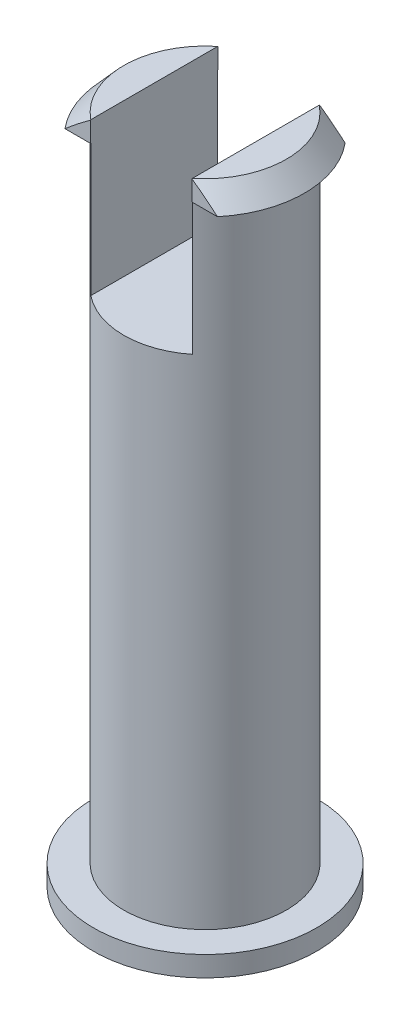
ISO-10303-21;
HEADER;
FILE_DESCRIPTION(('STEP AP214'),'2;1');
FILE_NAME('part.step','',(''),(''),'','','');
FILE_SCHEMA(('AUTOMOTIVE_DESIGN { 1 0 10303 214 1 1 1 1 }'));
ENDSEC;
DATA;
#1=APPLICATION_CONTEXT('core data for automotive mechanical design processes');
#2=APPLICATION_PROTOCOL_DEFINITION('international standard','automotive_design',2000,#1);
#3=PRODUCT_CONTEXT('',#1,'mechanical');
#4=PRODUCT('Part','Part','',(#3));
#5=PRODUCT_RELATED_PRODUCT_CATEGORY('part','',(#4));
#6=PRODUCT_DEFINITION_FORMATION('','',#4);
#7=PRODUCT_DEFINITION_CONTEXT('part definition',#1,'design');
#8=PRODUCT_DEFINITION('design','',#6,#7);
#9=PRODUCT_DEFINITION_SHAPE('','',#8);
#10=(LENGTH_UNIT() NAMED_UNIT(*) SI_UNIT(.MILLI.,.METRE.));
#11=(NAMED_UNIT(*) PLANE_ANGLE_UNIT() SI_UNIT($,.RADIAN.));
#12=(NAMED_UNIT(*) SI_UNIT($,.STERADIAN.) SOLID_ANGLE_UNIT());
#13=UNCERTAINTY_MEASURE_WITH_UNIT(LENGTH_MEASURE(1.E-05),#10,'distance_accuracy_value','');
#14=(GEOMETRIC_REPRESENTATION_CONTEXT(3) GLOBAL_UNCERTAINTY_ASSIGNED_CONTEXT((#13)) GLOBAL_UNIT_ASSIGNED_CONTEXT((#10,
#11,#12)) REPRESENTATION_CONTEXT('',''));
#15=CARTESIAN_POINT('',(0.,0.,0.));
#16=DIRECTION('',(0.,0.,1.));
#17=DIRECTION('',(1.,0.,0.));
#18=AXIS2_PLACEMENT_3D('',#15,#16,#17);
#19=CARTESIAN_POINT('',(0.,32.,0.));
#20=DIRECTION('',(0.,1.,0.));
#21=DIRECTION('',(0.,0.,1.));
#22=AXIS2_PLACEMENT_3D('',#19,#20,#21);
#23=PLANE('',#22);
#24=CARTESIAN_POINT('',(0.,32.,0.));
#25=DIRECTION('',(0.,-1.,0.));
#26=DIRECTION('',(0.,0.,-1.));
#27=AXIS2_PLACEMENT_3D('',#24,#25,#26);
#28=CIRCLE('',#27,3.99999999999999);
#29=CARTESIAN_POINT('',(2.5,32.,-3.12249899919918));
#30=VERTEX_POINT('',#29);
#31=CARTESIAN_POINT('',(2.5,32.,3.12249899919918));
#32=VERTEX_POINT('',#31);
#33=EDGE_CURVE('E141',#30,#32,#28,.T.);
#34=ORIENTED_EDGE('',*,*,#33,.F.);
#35=DIRECTION('',(0.,0.,-1.));
#36=VECTOR('',#35,1.);
#37=CARTESIAN_POINT('',(2.5,32.,4.));
#38=LINE('',#37,#36);
#39=EDGE_CURVE('E181',#32,#30,#38,.T.);
#40=ORIENTED_EDGE('',*,*,#39,.F.);
#41=EDGE_LOOP('',(#34,#40));
#42=FACE_BOUND('',#41,.T.);
#43=ADVANCED_FACE('F32',(#42),#23,.T.);
#44=CARTESIAN_POINT('',(-2.5,32.,3.12249899919919));
#45=VERTEX_POINT('',#44);
#46=CARTESIAN_POINT('',(-2.5,32.,-3.12249899919919));
#47=VERTEX_POINT('',#46);
#48=EDGE_CURVE('E184',#45,#47,#28,.T.);
#49=ORIENTED_EDGE('',*,*,#48,.F.);
#50=DIRECTION('',(0.,0.,1.));
#51=VECTOR('',#50,1.);
#52=CARTESIAN_POINT('',(-2.5,32.,4.));
#53=LINE('',#52,#51);
#54=EDGE_CURVE('E256',#47,#45,#53,.T.);
#55=ORIENTED_EDGE('',*,*,#54,.F.);
#56=EDGE_LOOP('',(#49,#55));
#57=FACE_BOUND('',#56,.T.);
#58=ADVANCED_FACE('F245',(#57),#23,.T.);
#59=CARTESIAN_POINT('',(0.,32.,0.));
#60=DIRECTION('',(0.,-1.,0.));
#61=DIRECTION('',(0.,0.,-1.));
#62=AXIS2_PLACEMENT_3D('',#59,#60,#61);
#63=CYLINDRICAL_SURFACE('',#62,4.);
#64=CARTESIAN_POINT('',(0.,31.,0.));
#65=DIRECTION('',(0.,1.,0.));
#66=DIRECTION('',(0.,0.,1.));
#67=AXIS2_PLACEMENT_3D('',#64,#65,#66);
#68=CIRCLE('',#67,4.);
#69=CARTESIAN_POINT('',(2.5,31.,3.1224989991992));
#70=VERTEX_POINT('',#69);
#71=CARTESIAN_POINT('',(2.5,31.,-3.1224989991992));
#72=VERTEX_POINT('',#71);
#73=EDGE_CURVE('E163',#70,#72,#68,.T.);
#74=ORIENTED_EDGE('',*,*,#73,.F.);
#75=DIRECTION('',(0.,-1.,0.));
#76=VECTOR('',#75,1.);
#77=CARTESIAN_POINT('',(2.5,32.,3.1224989991992));
#78=LINE('',#77,#76);
#79=CARTESIAN_POINT('',(2.5,24.5,3.1224989991992));
#80=VERTEX_POINT('',#79);
#81=EDGE_CURVE('E274',#70,#80,#78,.T.);
#82=ORIENTED_EDGE('',*,*,#81,.T.);
#83=CARTESIAN_POINT('',(0.,24.5,0.));
#84=DIRECTION('',(0.,-1.,0.));
#85=DIRECTION('',(0.,0.,-1.));
#86=AXIS2_PLACEMENT_3D('',#83,#84,#85);
#87=CIRCLE('',#86,4.);
#88=CARTESIAN_POINT('',(-2.5,24.5,3.1224989991992));
#89=VERTEX_POINT('',#88);
#90=EDGE_CURVE('E168',#80,#89,#87,.T.);
#91=ORIENTED_EDGE('',*,*,#90,.T.);
#92=DIRECTION('',(0.,-1.,0.));
#93=VECTOR('',#92,1.);
#94=CARTESIAN_POINT('',(-2.5,32.,3.1224989991992));
#95=LINE('',#94,#93);
#96=CARTESIAN_POINT('',(-2.5,31.,3.1224989991992));
#97=VERTEX_POINT('',#96);
#98=EDGE_CURVE('E279',#89,#97,#95,.F.);
#99=ORIENTED_EDGE('',*,*,#98,.T.);
#100=CARTESIAN_POINT('',(-2.5,31.,-3.1224989991992));
#101=VERTEX_POINT('',#100);
#102=EDGE_CURVE('E160',#101,#97,#68,.T.);
#103=ORIENTED_EDGE('',*,*,#102,.F.);
#104=DIRECTION('',(0.,-1.,0.));
#105=VECTOR('',#104,1.);
#106=CARTESIAN_POINT('',(-2.5,32.,-3.1224989991992));
#107=LINE('',#106,#105);
#108=CARTESIAN_POINT('',(-2.5,24.5,-3.1224989991992));
#109=VERTEX_POINT('',#108);
#110=EDGE_CURVE('E284',#101,#109,#107,.T.);
#111=ORIENTED_EDGE('',*,*,#110,.T.);
#112=CARTESIAN_POINT('',(2.5,24.5,-3.1224989991992));
#113=VERTEX_POINT('',#112);
#114=EDGE_CURVE('E167',#109,#113,#87,.T.);
#115=ORIENTED_EDGE('',*,*,#114,.T.);
#116=DIRECTION('',(0.,-1.,0.));
#117=VECTOR('',#116,1.);
#118=CARTESIAN_POINT('',(2.5,32.,-3.1224989991992));
#119=LINE('',#118,#117);
#120=EDGE_CURVE('E269',#113,#72,#119,.F.);
#121=ORIENTED_EDGE('',*,*,#120,.T.);
#122=EDGE_LOOP('',(#74,#82,#91,#99,#103,#111,#115,#121));
#123=FACE_BOUND('',#122,.T.);
#124=CARTESIAN_POINT('',(0.,0.,0.));
#125=DIRECTION('',(0.,-1.,0.));
#126=DIRECTION('',(0.,0.,-1.));
#127=AXIS2_PLACEMENT_3D('',#124,#125,#126);
#128=CIRCLE('',#127,4.);
#129=CARTESIAN_POINT('',(0.,0.,-4.));
#130=VERTEX_POINT('',#129);
#131=EDGE_CURVE('E156',#130,#130,#128,.T.);
#132=ORIENTED_EDGE('',*,*,#131,.F.);
#133=EDGE_LOOP('',(#132));
#134=FACE_BOUND('',#133,.T.);
#135=ADVANCED_FACE('F34',(#123,#134),#63,.T.);
#136=CARTESIAN_POINT('',(0.,-1.,0.));
#137=DIRECTION('',(0.,1.,0.));
#138=DIRECTION('',(0.,0.,1.));
#139=AXIS2_PLACEMENT_3D('',#136,#137,#138);
#140=CYLINDRICAL_SURFACE('',#139,5.5);
#141=CARTESIAN_POINT('',(0.,-1.,0.));
#142=DIRECTION('',(0.,-1.,0.));
#143=DIRECTION('',(0.,0.,-1.));
#144=AXIS2_PLACEMENT_3D('',#141,#142,#143);
#145=CIRCLE('',#144,5.5);
#146=CARTESIAN_POINT('',(0.,-1.,-5.5));
#147=VERTEX_POINT('',#146);
#148=EDGE_CURVE('E150',#147,#147,#145,.T.);
#149=ORIENTED_EDGE('',*,*,#148,.F.);
#150=EDGE_LOOP('',(#149));
#151=FACE_BOUND('',#150,.T.);
#152=CARTESIAN_POINT('',(0.,0.,0.));
#153=DIRECTION('',(0.,-1.,0.));
#154=DIRECTION('',(0.,0.,-1.));
#155=AXIS2_PLACEMENT_3D('',#152,#153,#154);
#156=CIRCLE('',#155,5.5);
#157=CARTESIAN_POINT('',(0.,0.,-5.5));
#158=VERTEX_POINT('',#157);
#159=EDGE_CURVE('E147',#158,#158,#156,.T.);
#160=ORIENTED_EDGE('',*,*,#159,.T.);
#161=EDGE_LOOP('',(#160));
#162=FACE_BOUND('',#161,.T.);
#163=ADVANCED_FACE('F236',(#151,#162),#140,.T.);
#164=CARTESIAN_POINT('',(0.,-1.,0.));
#165=DIRECTION('',(0.,-1.,0.));
#166=DIRECTION('',(0.,0.,-1.));
#167=AXIS2_PLACEMENT_3D('',#164,#165,#166);
#168=PLANE('',#167);
#169=ORIENTED_EDGE('',*,*,#148,.T.);
#170=EDGE_LOOP('',(#169));
#171=FACE_BOUND('',#170,.T.);
#172=ADVANCED_FACE('F231',(#171),#168,.T.);
#173=CARTESIAN_POINT('',(0.,0.,0.));
#174=DIRECTION('',(0.,-1.,0.));
#175=DIRECTION('',(0.,0.,-1.));
#176=AXIS2_PLACEMENT_3D('',#173,#174,#175);
#177=PLANE('',#176);
#178=ORIENTED_EDGE('',*,*,#131,.T.);
#179=EDGE_LOOP('',(#178));
#180=FACE_BOUND('',#179,.T.);
#181=ORIENTED_EDGE('',*,*,#159,.F.);
#182=EDGE_LOOP('',(#181));
#183=FACE_BOUND('',#182,.T.);
#184=ADVANCED_FACE('F235',(#180,#183),#177,.F.);
#185=CARTESIAN_POINT('',(0.,31.,0.));
#186=DIRECTION('',(0.,1.,0.));
#187=DIRECTION('',(0.,0.,1.));
#188=AXIS2_PLACEMENT_3D('',#185,#186,#187);
#189=PLANE('',#188);
#190=DIRECTION('',(-1.,0.,0.));
#191=VECTOR('',#190,1.);
#192=CARTESIAN_POINT('',(-3.75,31.,-3.142053468673));
#193=LINE('',#192,#191);
#194=CARTESIAN_POINT('',(-2.5,31.,-3.142053468673));
#195=VERTEX_POINT('',#194);
#196=CARTESIAN_POINT('',(-3.75,31.,-3.142053468673));
#197=VERTEX_POINT('',#196);
#198=EDGE_CURVE('E132',#195,#197,#193,.T.);
#199=ORIENTED_EDGE('',*,*,#198,.F.);
#200=DIRECTION('',(0.,0.,1.));
#201=VECTOR('',#200,1.);
#202=CARTESIAN_POINT('',(-2.5,31.,0.));
#203=LINE('',#202,#201);
#204=EDGE_CURVE('E280',#195,#101,#203,.T.);
#205=ORIENTED_EDGE('',*,*,#204,.T.);
#206=ORIENTED_EDGE('',*,*,#102,.T.);
#207=CARTESIAN_POINT('',(-2.5,31.,3.142053468673));
#208=VERTEX_POINT('',#207);
#209=EDGE_CURVE('E276',#97,#208,#203,.T.);
#210=ORIENTED_EDGE('',*,*,#209,.T.);
#211=DIRECTION('',(1.,0.,0.));
#212=VECTOR('',#211,1.);
#213=CARTESIAN_POINT('',(-3.75,31.,3.142053468673));
#214=LINE('',#213,#212);
#215=CARTESIAN_POINT('',(-3.75,31.,3.142053468673));
#216=VERTEX_POINT('',#215);
#217=EDGE_CURVE('E133',#216,#208,#214,.T.);
#218=ORIENTED_EDGE('',*,*,#217,.F.);
#219=CARTESIAN_POINT('',(0.,31.,0.));
#220=DIRECTION('',(0.,1.,0.));
#221=DIRECTION('',(0.,0.,1.));
#222=AXIS2_PLACEMENT_3D('',#219,#220,#221);
#223=CIRCLE('',#222,4.89234095295902);
#224=EDGE_CURVE('E286',#197,#216,#223,.T.);
#225=ORIENTED_EDGE('',*,*,#224,.F.);
#226=EDGE_LOOP('',(#199,#205,#206,#210,#218,#225));
#227=FACE_BOUND('',#226,.T.);
#228=ADVANCED_FACE('F240',(#227),#189,.F.);
#229=CARTESIAN_POINT('',(-3.75,32.,-3.142053468673));
#230=DIRECTION('',(0.,0.,1.));
#231=DIRECTION('',(1.,0.,0.));
#232=AXIS2_PLACEMENT_3D('',#229,#230,#231);
#233=PLANE('',#232);
#234=ORIENTED_EDGE('',*,*,#198,.T.);
#235=CARTESIAN_POINT('',(-5.75140238998282,29.1381890385367,-3.142053468673));
#236=CARTESIAN_POINT('',(-5.66143479160412,29.2266658021532,-3.142053468673));
#237=CARTESIAN_POINT('',(-5.57123159952465,29.3149027677412,-3.142053468673));
#238=CARTESIAN_POINT('',(-5.39028417101633,29.4908232063128,-3.142053468673));
#239=CARTESIAN_POINT('',(-5.29953992516586,29.5785066696028,-3.142053468673));
#240=CARTESIAN_POINT('',(-5.02651423388417,29.8404974377583,-3.142053468673));
#241=CARTESIAN_POINT('',(-4.84332272716632,30.013860658631,-3.142053468673));
#242=CARTESIAN_POINT('',(-4.47537104860759,30.3557161383797,-3.142053468673));
#243=CARTESIAN_POINT('',(-4.29063795138507,30.5242374796827,-3.142053468673));
#244=CARTESIAN_POINT('',(-3.91688275102535,30.8568178002116,-3.142053468673));
#245=CARTESIAN_POINT('',(-3.72785714758019,31.0208728788594,-3.142053468673));
#246=CARTESIAN_POINT('',(-3.43894286082393,31.2628849006011,-3.142053468673));
#247=CARTESIAN_POINT('',(-3.34114794078742,31.3433402621166,-3.142053468673));
#248=CARTESIAN_POINT('',(-3.14385088877077,31.5021249914611,-3.142053468673));
#249=CARTESIAN_POINT('',(-3.04434885484202,31.580454480731,-3.142053468673));
#250=CARTESIAN_POINT('',(-2.84351221327454,31.7343359877648,-3.142053468673));
#251=CARTESIAN_POINT('',(-2.74218144431509,31.8098929972481,-3.142053468673));
#252=CARTESIAN_POINT('',(-2.53713803828095,31.9576983242681,-3.142053468673));
#253=CARTESIAN_POINT('',(-2.43342561497153,32.0299469370206,-3.142053468673));
#254=CARTESIAN_POINT('',(-2.22210655580216,32.1709400583823,-3.142053468673));
#255=CARTESIAN_POINT('',(-2.11447116307328,32.2396417915894,-3.142053468673));
#256=CARTESIAN_POINT('',(-1.89589135819237,32.3714132678742,-3.142053468673));
#257=CARTESIAN_POINT('',(-1.78494938684956,32.4344870343902,-3.142053468673));
#258=CARTESIAN_POINT('',(-1.55836805387525,32.5537790287165,-3.142053468673));
#259=CARTESIAN_POINT('',(-1.44270127380101,32.6099462438958,-3.142053468673));
#260=CARTESIAN_POINT('',(-1.20683496765356,32.7126119286809,-3.142053468673));
#261=CARTESIAN_POINT('',(-1.08662457099351,32.7590852155489,-3.142053468673));
#262=CARTESIAN_POINT('',(-0.964153252771082,32.799410199883,-3.142053468673));
#263=B_SPLINE_CURVE_WITH_KNOTS('',3,(#235,#236,#237,#238,#239,#240,#241,#242,#243,#244,#245,
#246,#247,#248,#249,#250,#251,#252,#253,#254,#255,#256,#257,#258,#259,#260,#261,#262),
.UNSPECIFIED.,.F.,.F.,(4,2,2,2,2,2,2,2,2,2,2,2,2,4),(0.,0.37854974932779,0.757106109886597,
1.51372533961477,2.26383199375964,3.0145739975077,3.39446214364447,3.77432854273527,
4.15347361033775,4.5325847797815,4.91552603132517,5.29819128691846,5.68353189812134,
6.06986140601322),.UNSPECIFIED.);
#264=CARTESIAN_POINT('',(-2.5,31.9828727993128,-3.142053468673));
#265=VERTEX_POINT('',#264);
#266=EDGE_CURVE('E220',#197,#265,#263,.T.);
#267=ORIENTED_EDGE('',*,*,#266,.T.);
#268=DIRECTION('',(0.,-1.,0.));
#269=VECTOR('',#268,1.);
#270=CARTESIAN_POINT('',(-2.5,32.,-3.142053468673));
#271=LINE('',#270,#269);
#272=EDGE_CURVE('E282',#265,#195,#271,.T.);
#273=ORIENTED_EDGE('',*,*,#272,.T.);
#274=EDGE_LOOP('',(#234,#267,#273));
#275=FACE_BOUND('',#274,.T.);
#276=ADVANCED_FACE('F196',(#275),#233,.F.);
#277=CARTESIAN_POINT('',(-3.75,32.,3.142053468673));
#278=DIRECTION('',(0.,0.,-1.));
#279=DIRECTION('',(-1.,0.,0.));
#280=AXIS2_PLACEMENT_3D('',#277,#278,#279);
#281=PLANE('',#280);
#282=DIRECTION('',(0.,1.,0.));
#283=VECTOR('',#282,1.);
#284=CARTESIAN_POINT('',(-2.5,32.,3.142053468673));
#285=LINE('',#284,#283);
#286=CARTESIAN_POINT('',(-2.5,31.9828727993128,3.142053468673));
#287=VERTEX_POINT('',#286);
#288=EDGE_CURVE('E165',#208,#287,#285,.T.);
#289=ORIENTED_EDGE('',*,*,#288,.T.);
#290=CARTESIAN_POINT('',(-0.964153252771082,32.799410199883,3.142053468673));
#291=CARTESIAN_POINT('',(-1.03002369430808,32.7777542241144,3.142053468673));
#292=CARTESIAN_POINT('',(-1.09526715746155,32.7542792462752,3.142053468673));
#293=CARTESIAN_POINT('',(-1.22447137672742,32.7041365174771,3.142053468673));
#294=CARTESIAN_POINT('',(-1.28843292101153,32.6774708032889,3.142053468673));
#295=CARTESIAN_POINT('',(-1.47810868858984,32.5934720339867,3.142053468673));
#296=CARTESIAN_POINT('',(-1.60199536545019,32.5320069060682,3.142053468673));
#297=CARTESIAN_POINT('',(-1.8442833875694,32.4014187026276,3.142053468673));
#298=CARTESIAN_POINT('',(-1.9627209397165,32.3323614504243,3.142053468673));
#299=CARTESIAN_POINT('',(-2.19591971497473,32.18813994445,3.142053468673));
#300=CARTESIAN_POINT('',(-2.31067795089167,32.1129708953108,3.142053468673));
#301=CARTESIAN_POINT('',(-2.5201337413975,31.9695976422945,3.142053468673));
#302=CARTESIAN_POINT('',(-2.61526943991403,31.9020279413195,3.142053468673));
#303=CARTESIAN_POINT('',(-2.80358498764219,31.7642094591772,3.142053468673));
#304=CARTESIAN_POINT('',(-2.8967646866195,31.693960473381,3.142053468673));
#305=CARTESIAN_POINT('',(-3.17447083958148,31.4794741671771,3.142053468673));
#306=CARTESIAN_POINT('',(-3.35647771671642,31.3319784053042,3.142053468673));
#307=CARTESIAN_POINT('',(-3.72958635869864,31.019407429095,3.142053468673));
#308=CARTESIAN_POINT('',(-3.92028742778208,30.853859162247,3.142053468673));
#309=CARTESIAN_POINT('',(-4.29752146771366,30.5180396684989,3.142053468673));
#310=CARTESIAN_POINT('',(-4.48405375502863,30.3477676771851,3.142053468673));
#311=CARTESIAN_POINT('',(-4.85207773311101,30.005602602274,3.142053468673));
#312=CARTESIAN_POINT('',(-5.03360144760515,29.8337438369704,3.142053468673));
#313=CARTESIAN_POINT('',(-5.30406446571246,29.5741404653908,3.142053468673));
#314=CARTESIAN_POINT('',(-5.39389614751479,29.4873221153685,3.142053468673));
#315=CARTESIAN_POINT('',(-5.57302967125189,29.3131438071678,3.142053468673));
#316=CARTESIAN_POINT('',(-5.66233152334908,29.2257838594437,3.142053468673));
#317=CARTESIAN_POINT('',(-5.75140238998282,29.1381890385367,3.142053468673));
#318=B_SPLINE_CURVE_WITH_KNOTS('',3,(#290,#291,#292,#293,#294,#295,#296,#297,#298,#299,#300,
#301,#302,#303,#304,#305,#306,#307,#308,#309,#310,#311,#312,#313,#314,#315,#316,#317),
.UNSPECIFIED.,.F.,.F.,(4,2,2,2,2,2,2,2,2,2,2,2,2,4),(0.,0.207947765083646,0.415763490175816,
0.8301906187741,1.24127232529147,1.65267974150401,2.00269595021136,2.35273894494509,
3.05533692965475,3.81283816675367,4.57046270938131,5.32034936578617,5.69513342033319,
6.06991026293348),.UNSPECIFIED.);
#319=EDGE_CURVE('E52',#287,#216,#318,.T.);
#320=ORIENTED_EDGE('',*,*,#319,.T.);
#321=ORIENTED_EDGE('',*,*,#217,.T.);
#322=EDGE_LOOP('',(#289,#320,#321));
#323=FACE_BOUND('',#322,.T.);
#324=ADVANCED_FACE('F230',(#323),#281,.F.);
#325=CARTESIAN_POINT('',(2.5,31.,3.142053468673));
#326=VERTEX_POINT('',#325);
#327=CARTESIAN_POINT('',(3.75,31.,3.142053468673));
#328=VERTEX_POINT('',#327);
#329=EDGE_CURVE('E287',#326,#328,#214,.T.);
#330=ORIENTED_EDGE('',*,*,#329,.F.);
#331=DIRECTION('',(0.,0.,-1.));
#332=VECTOR('',#331,1.);
#333=CARTESIAN_POINT('',(2.5,31.,0.));
#334=LINE('',#333,#332);
#335=EDGE_CURVE('E270',#326,#70,#334,.T.);
#336=ORIENTED_EDGE('',*,*,#335,.T.);
#337=ORIENTED_EDGE('',*,*,#73,.T.);
#338=CARTESIAN_POINT('',(2.5,31.,-3.142053468673));
#339=VERTEX_POINT('',#338);
#340=EDGE_CURVE('E146',#72,#339,#334,.T.);
#341=ORIENTED_EDGE('',*,*,#340,.T.);
#342=CARTESIAN_POINT('',(3.75,31.,-3.142053468673));
#343=VERTEX_POINT('',#342);
#344=EDGE_CURVE('E139',#343,#339,#193,.T.);
#345=ORIENTED_EDGE('',*,*,#344,.F.);
#346=CARTESIAN_POINT('',(0.,31.,0.));
#347=DIRECTION('',(0.,1.,0.));
#348=DIRECTION('',(0.,0.,1.));
#349=AXIS2_PLACEMENT_3D('',#346,#347,#348);
#350=CIRCLE('',#349,4.89234095295902);
#351=EDGE_CURVE('E124',#328,#343,#350,.T.);
#352=ORIENTED_EDGE('',*,*,#351,.F.);
#353=EDGE_LOOP('',(#330,#336,#337,#341,#345,#352));
#354=FACE_BOUND('',#353,.T.);
#355=ADVANCED_FACE('F144',(#354),#189,.F.);
#356=ORIENTED_EDGE('',*,*,#329,.T.);
#357=CARTESIAN_POINT('',(5.00371957476869,29.8613063583285,3.142053468673));
#358=CARTESIAN_POINT('',(4.91194455160935,29.9483979380869,3.142053468673));
#359=CARTESIAN_POINT('',(4.81983758532469,30.035141572481,3.142053468673));
#360=CARTESIAN_POINT('',(4.63484235943004,30.2078016732658,3.142053468673));
#361=CARTESIAN_POINT('',(4.54195405658586,30.2937180933119,3.142053468673));
#362=CARTESIAN_POINT('',(4.35520462329431,30.4646599438612,3.142053468673));
#363=CARTESIAN_POINT('',(4.26134268971944,30.5496844992159,3.142053468673));
#364=CARTESIAN_POINT('',(4.07258817740614,30.7185753725122,3.142053468673));
#365=CARTESIAN_POINT('',(3.97769561610261,30.8024417099928,3.142053468673));
#366=CARTESIAN_POINT('',(3.69338466322196,31.0501226082962,3.142053468673));
#367=CARTESIAN_POINT('',(3.50222339204617,31.2119649658142,3.142053468673));
#368=CARTESIAN_POINT('',(3.2106878205909,31.4488257657707,3.142053468673));
#369=CARTESIAN_POINT('',(3.11271077128794,31.5267952634901,3.142053468673));
#370=CARTESIAN_POINT('',(2.9148569948926,31.6802809205912,3.142053468673));
#371=CARTESIAN_POINT('',(2.8149803766297,31.7557972198536,3.142053468673));
#372=CARTESIAN_POINT('',(2.59364402331772,31.9179375377342,3.142053468673));
#373=CARTESIAN_POINT('',(2.47171172602454,32.0039215721897,3.142053468673));
#374=CARTESIAN_POINT('',(2.22405214945139,32.1700521706697,3.142053468673));
#375=CARTESIAN_POINT('',(2.0983280348354,32.2502034219417,3.142053468673));
#376=CARTESIAN_POINT('',(1.84131846945869,32.4032155094444,3.142053468673));
#377=CARTESIAN_POINT('',(1.71000207759047,32.4760253501033,3.142053468673));
#378=CARTESIAN_POINT('',(1.50872924827772,32.5771428609858,3.142053468673));
#379=CARTESIAN_POINT('',(1.44082668111819,32.6095376624309,3.142053468673));
#380=CARTESIAN_POINT('',(1.30353342293421,32.6711125458128,3.142053468673));
#381=CARTESIAN_POINT('',(1.23414184702022,32.700290649157,3.142053468673));
#382=CARTESIAN_POINT('',(1.1639928034548,32.727605105694,3.142053468673));
#383=B_SPLINE_CURVE_WITH_KNOTS('',3,(#357,#358,#359,#360,#361,#362,#363,#364,#365,#366,#367,
#368,#369,#370,#371,#372,#373,#374,#375,#376,#377,#378,#379,#380,#381,#382),.UNSPECIFIED.,.F.,
.F.,(4,2,2,2,2,2,2,2,2,2,2,2,4),(0.,0.379564190216634,0.759149523101463,1.13907781304132,
1.51899968579761,2.270235403786,2.64585012962907,3.02144340031562,3.46891552740144,
3.91602399970454,4.36605055866991,4.59167815418252,4.81744376798244),.UNSPECIFIED.);
#384=CARTESIAN_POINT('',(2.5,31.9828727993128,3.142053468673));
#385=VERTEX_POINT('',#384);
#386=EDGE_CURVE('E127',#328,#385,#383,.T.);
#387=ORIENTED_EDGE('',*,*,#386,.T.);
#388=DIRECTION('',(0.,-1.,0.));
#389=VECTOR('',#388,1.);
#390=CARTESIAN_POINT('',(2.5,32.,3.142053468673));
#391=LINE('',#390,#389);
#392=EDGE_CURVE('E272',#385,#326,#391,.T.);
#393=ORIENTED_EDGE('',*,*,#392,.T.);
#394=EDGE_LOOP('',(#356,#387,#393));
#395=FACE_BOUND('',#394,.T.);
#396=ADVANCED_FACE('F225',(#395),#281,.F.);
#397=DIRECTION('',(0.,1.,0.));
#398=VECTOR('',#397,1.);
#399=CARTESIAN_POINT('',(2.5,32.,-3.142053468673));
#400=LINE('',#399,#398);
#401=CARTESIAN_POINT('',(2.5,31.9828727993128,-3.142053468673));
#402=VERTEX_POINT('',#401);
#403=EDGE_CURVE('E140',#339,#402,#400,.T.);
#404=ORIENTED_EDGE('',*,*,#403,.T.);
#405=CARTESIAN_POINT('',(1.1639928034548,32.727605105694,-3.142053468673));
#406=CARTESIAN_POINT('',(1.23414184702022,32.700290649157,-3.142053468673));
#407=CARTESIAN_POINT('',(1.30353342293421,32.6711125458128,-3.142053468673));
#408=CARTESIAN_POINT('',(1.44082668111819,32.6095376624309,-3.142053468673));
#409=CARTESIAN_POINT('',(1.50872924827773,32.5771428609858,-3.142053468673));
#410=CARTESIAN_POINT('',(1.71000207759047,32.4760253501033,-3.142053468673));
#411=CARTESIAN_POINT('',(1.8413184694587,32.4032155094444,-3.142053468673));
#412=CARTESIAN_POINT('',(2.0983280348354,32.2502034219417,-3.142053468673));
#413=CARTESIAN_POINT('',(2.2240521494514,32.1700521706697,-3.142053468673));
#414=CARTESIAN_POINT('',(2.47171172602454,32.0039215721897,-3.142053468673));
#415=CARTESIAN_POINT('',(2.59364402331772,31.9179375377342,-3.142053468673));
#416=CARTESIAN_POINT('',(2.8149803766297,31.7557972198536,-3.142053468673));
#417=CARTESIAN_POINT('',(2.9148569948926,31.6802809205912,-3.142053468673));
#418=CARTESIAN_POINT('',(3.11271077128794,31.5267952634901,-3.142053468673));
#419=CARTESIAN_POINT('',(3.2106878205909,31.4488257657707,-3.142053468673));
#420=CARTESIAN_POINT('',(3.50222339204617,31.2119649658142,-3.142053468673));
#421=CARTESIAN_POINT('',(3.69338466322196,31.0501226082962,-3.142053468673));
#422=CARTESIAN_POINT('',(3.97769561610261,30.8024417099928,-3.142053468673));
#423=CARTESIAN_POINT('',(4.07258817740614,30.7185753725122,-3.142053468673));
#424=CARTESIAN_POINT('',(4.26134268971945,30.5496844992159,-3.142053468673));
#425=CARTESIAN_POINT('',(4.35520462329431,30.4646599438612,-3.142053468673));
#426=CARTESIAN_POINT('',(4.54195405658586,30.2937180933119,-3.142053468673));
#427=CARTESIAN_POINT('',(4.63484235943004,30.2078016732658,-3.142053468673));
#428=CARTESIAN_POINT('',(4.8198375853247,30.035141572481,-3.142053468673));
#429=CARTESIAN_POINT('',(4.91194455160935,29.9483979380869,-3.142053468673));
#430=CARTESIAN_POINT('',(5.00371957476869,29.8613063583285,-3.142053468673));
#431=B_SPLINE_CURVE_WITH_KNOTS('',3,(#405,#406,#407,#408,#409,#410,#411,#412,#413,#414,#415,
#416,#417,#418,#419,#420,#421,#422,#423,#424,#425,#426,#427,#428,#429,#430),.UNSPECIFIED.,.F.,
.F.,(4,2,2,2,2,2,2,2,2,2,2,2,4),(0.,0.225765613799923,0.451393209312538,0.901419768277907,
1.348528240581,1.79600036766683,2.17159363835337,2.54720836419644,3.29844408218484,
3.67836595494112,4.05829424488098,4.43787957776581,4.81744376798244),.UNSPECIFIED.);
#432=EDGE_CURVE('E60',#402,#343,#431,.T.);
#433=ORIENTED_EDGE('',*,*,#432,.T.);
#434=ORIENTED_EDGE('',*,*,#344,.T.);
#435=EDGE_LOOP('',(#404,#433,#434));
#436=FACE_BOUND('',#435,.T.);
#437=ADVANCED_FACE('F138',(#436),#233,.F.);
#438=CARTESIAN_POINT('',(0.,24.5,0.));
#439=DIRECTION('',(0.,-1.,0.));
#440=DIRECTION('',(0.,0.,-1.));
#441=AXIS2_PLACEMENT_3D('',#438,#439,#440);
#442=PLANE('',#441);
#443=DIRECTION('',(0.,0.,-1.));
#444=VECTOR('',#443,1.);
#445=CARTESIAN_POINT('',(2.5,24.5,4.));
#446=LINE('',#445,#444);
#447=EDGE_CURVE('E261',#80,#113,#446,.T.);
#448=ORIENTED_EDGE('',*,*,#447,.T.);
#449=ORIENTED_EDGE('',*,*,#114,.F.);
#450=DIRECTION('',(0.,0.,1.));
#451=VECTOR('',#450,1.);
#452=CARTESIAN_POINT('',(-2.5,24.5,4.));
#453=LINE('',#452,#451);
#454=EDGE_CURVE('E264',#109,#89,#453,.T.);
#455=ORIENTED_EDGE('',*,*,#454,.T.);
#456=ORIENTED_EDGE('',*,*,#90,.F.);
#457=EDGE_LOOP('',(#448,#449,#455,#456));
#458=FACE_BOUND('',#457,.T.);
#459=ADVANCED_FACE('F203',(#458),#442,.F.);
#460=CARTESIAN_POINT('',(-2.5,24.5,4.));
#461=DIRECTION('',(-1.,0.,0.));
#462=DIRECTION('',(0.,0.,1.));
#463=AXIS2_PLACEMENT_3D('',#460,#461,#462);
#464=PLANE('',#463);
#465=ORIENTED_EDGE('',*,*,#272,.F.);
#466=CARTESIAN_POINT('',(-2.5,28.1948106981986,-6.96015865345692));
#467=CARTESIAN_POINT('',(-2.5,28.4213246171115,-6.74532777603302));
#468=CARTESIAN_POINT('',(-2.5,28.6473314485054,-6.52995441028979));
#469=CARTESIAN_POINT('',(-2.5,29.0979910123562,-6.09746985341496));
#470=CARTESIAN_POINT('',(-2.5,29.322642640094,-5.88035751200612));
#471=CARTESIAN_POINT('',(-2.5,29.7757013161033,-5.43841462569107));
#472=CARTESIAN_POINT('',(-2.5,30.004055345202,-5.21352963543977));
#473=CARTESIAN_POINT('',(-2.5,30.4575795151988,-4.76084764596334));
#474=CARTESIAN_POINT('',(-2.5,30.6827516197005,-4.53305262408079));
#475=CARTESIAN_POINT('',(-2.5,31.0169902559807,-4.1880991682752));
#476=CARTESIAN_POINT('',(-2.5,31.1277795152047,-4.07261097456218));
#477=CARTESIAN_POINT('',(-2.5,31.3479047913885,-3.84025945817423));
#478=CARTESIAN_POINT('',(-2.5,31.4572408379516,-3.72339616360294));
#479=CARTESIAN_POINT('',(-2.5,31.6742888942638,-3.48771514937176));
#480=CARTESIAN_POINT('',(-2.5,31.7819970323893,-3.36889385557777));
#481=CARTESIAN_POINT('',(-2.5,31.9949742975195,-3.12909736225165));
#482=CARTESIAN_POINT('',(-2.5,32.1002436563538,-3.00812236939895));
#483=CARTESIAN_POINT('',(-2.5,32.3063442932544,-2.7647966648804));
#484=CARTESIAN_POINT('',(-2.5,32.4072124849914,-2.64247735904104));
#485=CARTESIAN_POINT('',(-2.5,32.6046177934651,-2.39427383239887));
#486=CARTESIAN_POINT('',(-2.5,32.7011529686514,-2.26838805392852));
#487=CARTESIAN_POINT('',(-2.5,32.8876529783234,-2.01249129682505));
#488=CARTESIAN_POINT('',(-2.5,32.9776399595136,-1.88249658203967));
#489=CARTESIAN_POINT('',(-2.5,33.1484526409702,-1.61667102132868));
#490=CARTESIAN_POINT('',(-2.5,33.2292886205736,-1.4808469649622));
#491=CARTESIAN_POINT('',(-2.5,33.3399157356409,-1.27201187319098));
#492=CARTESIAN_POINT('',(-2.5,33.3749292647064,-1.20177287102264));
#493=CARTESIAN_POINT('',(-2.5,33.4407213625249,-1.0592960746341));
#494=CARTESIAN_POINT('',(-2.5,33.4714988739963,-0.987057786789927));
#495=CARTESIAN_POINT('',(-2.5,33.5277733543064,-0.84078242371951));
#496=CARTESIAN_POINT('',(-2.5,33.5532859954765,-0.766751442216093));
#497=CARTESIAN_POINT('',(-2.5,33.5980916609838,-0.616820655065824));
#498=CARTESIAN_POINT('',(-2.5,33.6173864220937,-0.540921377656444));
#499=CARTESIAN_POINT('',(-2.5,33.6461506272823,-0.400348650021138));
#500=CARTESIAN_POINT('',(-2.5,33.6567188199309,-0.335900877792243));
#501=CARTESIAN_POINT('',(-2.5,33.6723710017324,-0.20634227558051));
#502=CARTESIAN_POINT('',(-2.5,33.6774558596049,-0.141231552278825));
#503=CARTESIAN_POINT('',(-2.5,33.6818963604733,-0.0108530866510768));
#504=CARTESIAN_POINT('',(-2.5,33.6812555995638,0.0544145313820277));
#505=CARTESIAN_POINT('',(-2.5,33.674287133399,0.184647438186064));
#506=CARTESIAN_POINT('',(-2.5,33.6679586423291,0.249612683934666));
#507=CARTESIAN_POINT('',(-2.5,33.6478765145714,0.393305284753485));
#508=CARTESIAN_POINT('',(-2.5,33.6327738622851,0.471844509131018));
#509=CARTESIAN_POINT('',(-2.5,33.5954018965698,0.627206928197103));
#510=CARTESIAN_POINT('',(-2.5,33.5731287214265,0.70402917430443));
#511=CARTESIAN_POINT('',(-2.5,33.522435591928,0.855943224563039));
#512=CARTESIAN_POINT('',(-2.5,33.4939907151252,0.931026604875421));
#513=CARTESIAN_POINT('',(-2.5,33.432108220532,1.07906823544426));
#514=CARTESIAN_POINT('',(-2.5,33.3986712722396,1.15202676910312));
#515=CARTESIAN_POINT('',(-2.5,33.312415791575,1.32707862256384));
#516=CARTESIAN_POINT('',(-2.5,33.2574709826539,1.42811944830884));
#517=CARTESIAN_POINT('',(-2.5,33.1414754482611,1.62665593019055));
#518=CARTESIAN_POINT('',(-2.5,33.0804209661146,1.72414935426779));
#519=CARTESIAN_POINT('',(-2.5,32.9536413967889,1.91635482917095));
#520=CARTESIAN_POINT('',(-2.5,32.8879057486988,2.01105986284071));
#521=CARTESIAN_POINT('',(-2.5,32.7530203902463,2.1979571508586));
#522=CARTESIAN_POINT('',(-2.5,32.6838714483356,2.29014996360678));
#523=CARTESIAN_POINT('',(-2.5,32.5422039510031,2.47343785884706));
#524=CARTESIAN_POINT('',(-2.5,32.4696578201662,2.56451153683892));
#525=CARTESIAN_POINT('',(-2.5,32.3224538954982,2.74493987925739));
#526=CARTESIAN_POINT('',(-2.5,32.2477959521879,2.83429442124347));
#527=CARTESIAN_POINT('',(-2.5,32.0215504976212,3.09997635397785));
#528=CARTESIAN_POINT('',(-2.5,31.8674812326226,3.27418839577398));
#529=CARTESIAN_POINT('',(-2.5,31.5692047058399,3.60298158551689));
#530=CARTESIAN_POINT('',(-2.5,31.4253739210608,3.75790777499916));
#531=CARTESIAN_POINT('',(-2.5,31.1351061088892,4.06530970261615));
#532=CARTESIAN_POINT('',(-2.5,30.9886689573395,4.21778532335333));
#533=CARTESIAN_POINT('',(-2.5,30.6937689300852,4.52096419981563));
#534=CARTESIAN_POINT('',(-2.5,30.5453047253574,4.67166615893636));
#535=CARTESIAN_POINT('',(-2.5,30.2469033370755,4.97160569973836));
#536=CARTESIAN_POINT('',(-2.5,30.0969661385709,5.12084326652556));
#537=CARTESIAN_POINT('',(-2.5,29.8020329360008,5.41214012566805));
#538=CARTESIAN_POINT('',(-2.5,29.6570824434574,5.55424555874167));
#539=CARTESIAN_POINT('',(-2.5,29.3663308368989,5.83758513701247));
#540=CARTESIAN_POINT('',(-2.5,29.2205297164476,5.97881927560042));
#541=CARTESIAN_POINT('',(-2.5,28.9283994729752,6.26041313636276));
#542=CARTESIAN_POINT('',(-2.5,28.7820711197972,6.40077365783161));
#543=CARTESIAN_POINT('',(-2.5,28.4888421722168,6.68089028847361));
#544=CARTESIAN_POINT('',(-2.5,28.3419415886749,6.82064640901255));
#545=CARTESIAN_POINT('',(-2.5,28.1948106981986,6.96015865345692));
#546=B_SPLINE_CURVE_WITH_KNOTS('',3,(#466,#467,#468,#469,#470,#471,#472,#473,#474,#475,#476,
#477,#478,#479,#480,#481,#482,#483,#484,#485,#486,#487,#488,#489,#490,#491,#492,#493,#494,#495,
#496,#497,#498,#499,#500,#501,#502,#503,#504,#505,#506,#507,#508,#509,#510,#511,#512,#513,#514,
#515,#516,#517,#518,#519,#520,#521,#522,#523,#524,#525,#526,#527,#528,#529,#530,#531,#532,#533,
#534,#535,#536,#537,#538,#539,#540,#541,#542,#543,#544,#545),.UNSPECIFIED.,.F.,.F.,(4,2,2,2,2,2,
2,2,2,2,2,2,2,2,2,2,2,2,2,2,2,2,2,2,2,2,2,2,2,2,2,2,2,2,2,2,2,2,2,4),(0.,0.936569124735106,
1.87381960152197,2.8352955607171,3.79614970496091,4.27625075404835,4.7563420080444,
5.23743660567248,5.71848528136797,6.19404991815219,6.66982556238016,7.1439090837229,
7.61745466812482,7.85279223750974,8.0881884394596,8.32287347708215,8.55749290576331,
8.75320441904434,8.94888492137778,9.14444253112464,9.34002716318709,9.57956442093396,
9.81923089886347,10.0598838297251,10.3005045150179,10.6452356959229,10.9901801606621,
11.3359291214504,11.6816005939671,12.0308689445485,12.3801620793611,13.0777313373502,
13.7118958538025,14.3460906606779,14.9807234070402,15.6153626014565,16.2243257664523,
16.8332935450939,17.4415824269982,18.0498598198184),.UNSPECIFIED.);
#547=EDGE_CURVE('E219',#265,#47,#546,.T.);
#548=ORIENTED_EDGE('',*,*,#547,.T.);
#549=ORIENTED_EDGE('',*,*,#54,.T.);
#550=EDGE_CURVE('E211',#45,#287,#546,.T.);
#551=ORIENTED_EDGE('',*,*,#550,.T.);
#552=ORIENTED_EDGE('',*,*,#288,.F.);
#553=ORIENTED_EDGE('',*,*,#209,.F.);
#554=ORIENTED_EDGE('',*,*,#98,.F.);
#555=ORIENTED_EDGE('',*,*,#454,.F.);
#556=ORIENTED_EDGE('',*,*,#110,.F.);
#557=ORIENTED_EDGE('',*,*,#204,.F.);
#558=EDGE_LOOP('',(#465,#548,#549,#551,#552,#553,#554,#555,#556,#557));
#559=FACE_BOUND('',#558,.T.);
#560=ADVANCED_FACE('F260',(#559),#464,.F.);
#561=CARTESIAN_POINT('',(2.5,24.5,4.));
#562=DIRECTION('',(1.,0.,0.));
#563=DIRECTION('',(0.,0.,-1.));
#564=AXIS2_PLACEMENT_3D('',#561,#562,#563);
#565=PLANE('',#564);
#566=ORIENTED_EDGE('',*,*,#392,.F.);
#567=CARTESIAN_POINT('',(2.5,28.1948106981986,6.96015865345692));
#568=CARTESIAN_POINT('',(2.5,28.4213246171115,6.74532777603302));
#569=CARTESIAN_POINT('',(2.5,28.6473314485054,6.52995441028979));
#570=CARTESIAN_POINT('',(2.5,29.0979910123562,6.09746985341497));
#571=CARTESIAN_POINT('',(2.5,29.322642640094,5.88035751200612));
#572=CARTESIAN_POINT('',(2.5,29.7757013161033,5.43841462569108));
#573=CARTESIAN_POINT('',(2.5,30.004055345202,5.21352963543977));
#574=CARTESIAN_POINT('',(2.5,30.4575795151988,4.76084764596335));
#575=CARTESIAN_POINT('',(2.5,30.6827516197005,4.5330526240808));
#576=CARTESIAN_POINT('',(2.5,31.0169902559807,4.18809916827521));
#577=CARTESIAN_POINT('',(2.5,31.1277795152047,4.07261097456219));
#578=CARTESIAN_POINT('',(2.5,31.3479047913885,3.84025945817424));
#579=CARTESIAN_POINT('',(2.5,31.4572408379516,3.72339616360295));
#580=CARTESIAN_POINT('',(2.5,31.6742888942638,3.48771514937177));
#581=CARTESIAN_POINT('',(2.5,31.7819970323893,3.36889385557778));
#582=CARTESIAN_POINT('',(2.5,31.9949742975195,3.12909736225167));
#583=CARTESIAN_POINT('',(2.5,32.1002436563538,3.00812236939896));
#584=CARTESIAN_POINT('',(2.5,32.3063442932544,2.76479666488042));
#585=CARTESIAN_POINT('',(2.5,32.4072124849913,2.64247735904106));
#586=CARTESIAN_POINT('',(2.5,32.6046177934651,2.39427383239889));
#587=CARTESIAN_POINT('',(2.5,32.7011529686514,2.26838805392854));
#588=CARTESIAN_POINT('',(2.5,32.8876529783234,2.01249129682507));
#589=CARTESIAN_POINT('',(2.5,32.9776399595136,1.88249658203969));
#590=CARTESIAN_POINT('',(2.5,33.1484526409702,1.6166710213287));
#591=CARTESIAN_POINT('',(2.5,33.2292886205735,1.48084696496221));
#592=CARTESIAN_POINT('',(2.5,33.3399157356409,1.272011873191));
#593=CARTESIAN_POINT('',(2.5,33.3749292647064,1.20177287102266));
#594=CARTESIAN_POINT('',(2.5,33.4407213625249,1.05929607463412));
#595=CARTESIAN_POINT('',(2.5,33.4714988739963,0.987057786789946));
#596=CARTESIAN_POINT('',(2.5,33.5277733543064,0.840782423719528));
#597=CARTESIAN_POINT('',(2.5,33.5532859954764,0.766751442216112));
#598=CARTESIAN_POINT('',(2.5,33.5980916609838,0.616820655065842));
#599=CARTESIAN_POINT('',(2.5,33.6173864220937,0.540921377656462));
#600=CARTESIAN_POINT('',(2.5,33.6461506272823,0.400348650021155));
#601=CARTESIAN_POINT('',(2.5,33.6567188199309,0.335900877792261));
#602=CARTESIAN_POINT('',(2.5,33.6723710017324,0.206342275580529));
#603=CARTESIAN_POINT('',(2.5,33.6774558596049,0.141231552278843));
#604=CARTESIAN_POINT('',(2.5,33.6818963604733,0.0108530866510943));
#605=CARTESIAN_POINT('',(2.5,33.6812555995638,-0.0544145313820102));
#606=CARTESIAN_POINT('',(2.5,33.674287133399,-0.184647438186046));
#607=CARTESIAN_POINT('',(2.5,33.6679586423291,-0.249612683934649));
#608=CARTESIAN_POINT('',(2.5,33.6478765145714,-0.393305284753467));
#609=CARTESIAN_POINT('',(2.5,33.6327738622851,-0.471844509131001));
#610=CARTESIAN_POINT('',(2.5,33.5954018965698,-0.627206928197085));
#611=CARTESIAN_POINT('',(2.5,33.5731287214265,-0.704029174304411));
#612=CARTESIAN_POINT('',(2.5,33.522435591928,-0.855943224563021));
#613=CARTESIAN_POINT('',(2.5,33.4939907151252,-0.931026604875404));
#614=CARTESIAN_POINT('',(2.5,33.432108220532,-1.07906823544424));
#615=CARTESIAN_POINT('',(2.5,33.3986712722396,-1.1520267691031));
#616=CARTESIAN_POINT('',(2.5,33.312415791575,-1.32707862256382));
#617=CARTESIAN_POINT('',(2.5,33.2574709826539,-1.42811944830881));
#618=CARTESIAN_POINT('',(2.5,33.1414754482611,-1.62665593019051));
#619=CARTESIAN_POINT('',(2.5,33.0804209661147,-1.72414935426775));
#620=CARTESIAN_POINT('',(2.5,32.9536413967889,-1.91635482917091));
#621=CARTESIAN_POINT('',(2.5,32.8879057486988,-2.01105986284066));
#622=CARTESIAN_POINT('',(2.5,32.7530203902463,-2.19795715085855));
#623=CARTESIAN_POINT('',(2.5,32.6838714483356,-2.29014996360673));
#624=CARTESIAN_POINT('',(2.5,32.5422039510032,-2.473437858847));
#625=CARTESIAN_POINT('',(2.5,32.4696578201663,-2.56451153683886));
#626=CARTESIAN_POINT('',(2.5,32.3224538954982,-2.74493987925733));
#627=CARTESIAN_POINT('',(2.5,32.2477959521879,-2.83429442124341));
#628=CARTESIAN_POINT('',(2.5,32.0215504976212,-3.09997635397779));
#629=CARTESIAN_POINT('',(2.5,31.8674812326227,-3.27418839577391));
#630=CARTESIAN_POINT('',(2.5,31.56920470584,-3.60298158551683));
#631=CARTESIAN_POINT('',(2.5,31.4253739210609,-3.75790777499911));
#632=CARTESIAN_POINT('',(2.5,31.1351061088892,-4.0653097026161));
#633=CARTESIAN_POINT('',(2.5,30.9886689573395,-4.21778532335328));
#634=CARTESIAN_POINT('',(2.5,30.6937689300852,-4.52096419981559));
#635=CARTESIAN_POINT('',(2.5,30.5453047253574,-4.67166615893633));
#636=CARTESIAN_POINT('',(2.5,30.2469033370755,-4.97160569973833));
#637=CARTESIAN_POINT('',(2.5,30.0969661385709,-5.12084326652553));
#638=CARTESIAN_POINT('',(2.5,29.8020329360009,-5.41214012566803));
#639=CARTESIAN_POINT('',(2.5,29.6570824434574,-5.55424555874165));
#640=CARTESIAN_POINT('',(2.5,29.3663308368989,-5.83758513701245));
#641=CARTESIAN_POINT('',(2.5,29.2205297164476,-5.97881927560041));
#642=CARTESIAN_POINT('',(2.5,28.9283994729752,-6.26041313636275));
#643=CARTESIAN_POINT('',(2.5,28.7820711197972,-6.4007736578316));
#644=CARTESIAN_POINT('',(2.5,28.4888421722168,-6.68089028847361));
#645=CARTESIAN_POINT('',(2.5,28.3419415886749,-6.82064640901255));
#646=CARTESIAN_POINT('',(2.5,28.1948106981986,-6.96015865345693));
#647=B_SPLINE_CURVE_WITH_KNOTS('',3,(#567,#568,#569,#570,#571,#572,#573,#574,#575,#576,#577,
#578,#579,#580,#581,#582,#583,#584,#585,#586,#587,#588,#589,#590,#591,#592,#593,#594,#595,#596,
#597,#598,#599,#600,#601,#602,#603,#604,#605,#606,#607,#608,#609,#610,#611,#612,#613,#614,#615,
#616,#617,#618,#619,#620,#621,#622,#623,#624,#625,#626,#627,#628,#629,#630,#631,#632,#633,#634,
#635,#636,#637,#638,#639,#640,#641,#642,#643,#644,#645,#646),.UNSPECIFIED.,.F.,.F.,(4,2,2,2,2,2,
2,2,2,2,2,2,2,2,2,2,2,2,2,2,2,2,2,2,2,2,2,2,2,2,2,2,2,2,2,2,2,2,2,4),(0.,0.9365691247351,
1.87381960152196,2.8352955607171,3.7961497049609,4.27625075404834,4.75634200804438,
5.23743660567247,5.71848528136796,6.19404991815218,6.66982556238014,7.14390908372288,
7.6174546681248,7.85279223750972,8.08818843945958,8.32287347708213,8.55749290576329,
8.75320441904432,8.94888492137777,9.14444253112463,9.34002716318708,9.57956442093394,
9.81923089886345,10.0598838297251,10.3005045150179,10.6452356959228,10.990180160662,
11.3359291214504,11.681600593967,12.0308689445485,12.380162079361,13.0777313373501,
13.7118958538024,14.3460906606778,14.9807234070401,15.6153626014565,16.2243257664523,
16.8332935450938,17.4415824269982,18.0498598198185),.UNSPECIFIED.);
#648=EDGE_CURVE('E11',#385,#32,#647,.T.);
#649=ORIENTED_EDGE('',*,*,#648,.T.);
#650=ORIENTED_EDGE('',*,*,#39,.T.);
#651=EDGE_CURVE('E36',#30,#402,#647,.T.);
#652=ORIENTED_EDGE('',*,*,#651,.T.);
#653=ORIENTED_EDGE('',*,*,#403,.F.);
#654=ORIENTED_EDGE('',*,*,#340,.F.);
#655=ORIENTED_EDGE('',*,*,#120,.F.);
#656=ORIENTED_EDGE('',*,*,#447,.F.);
#657=ORIENTED_EDGE('',*,*,#81,.F.);
#658=ORIENTED_EDGE('',*,*,#335,.F.);
#659=EDGE_LOOP('',(#566,#649,#650,#652,#653,#654,#655,#656,#657,#658));
#660=FACE_BOUND('',#659,.T.);
#661=ADVANCED_FACE('F179',(#660),#565,.F.);
#662=CARTESIAN_POINT('',(0.,32.,0.));
#663=DIRECTION('',(0.,-1.,0.));
#664=DIRECTION('',(0.,0.,-1.));
#665=AXIS2_PLACEMENT_3D('',#662,#663,#664);
#666=CONICAL_SURFACE('',#665,3.99999999999999,0.728567432856023);
#667=ORIENTED_EDGE('',*,*,#351,.T.);
#668=ORIENTED_EDGE('',*,*,#432,.F.);
#669=ORIENTED_EDGE('',*,*,#651,.F.);
#670=ORIENTED_EDGE('',*,*,#33,.T.);
#671=ORIENTED_EDGE('',*,*,#648,.F.);
#672=ORIENTED_EDGE('',*,*,#386,.F.);
#673=EDGE_LOOP('',(#667,#668,#669,#670,#671,#672));
#674=FACE_BOUND('',#673,.T.);
#675=ADVANCED_FACE('F125',(#674),#666,.T.);
#676=ORIENTED_EDGE('',*,*,#224,.T.);
#677=ORIENTED_EDGE('',*,*,#319,.F.);
#678=ORIENTED_EDGE('',*,*,#550,.F.);
#679=ORIENTED_EDGE('',*,*,#48,.T.);
#680=ORIENTED_EDGE('',*,*,#547,.F.);
#681=ORIENTED_EDGE('',*,*,#266,.F.);
#682=EDGE_LOOP('',(#676,#677,#678,#679,#680,#681));
#683=FACE_BOUND('',#682,.T.);
#684=ADVANCED_FACE('F199',(#683),#666,.T.);
#685=CLOSED_SHELL('',(#43,#58,#135,#163,#172,#184,#228,#276,#324,#355,#396,#437,#459,#560,#661,
#675,#684));
#686=MANIFOLD_SOLID_BREP('B2',#685);
#687=ADVANCED_BREP_SHAPE_REPRESENTATION('',(#18,#686),#14);
#688=SHAPE_DEFINITION_REPRESENTATION(#9,#687);
ENDSEC;
END-ISO-10303-21;
